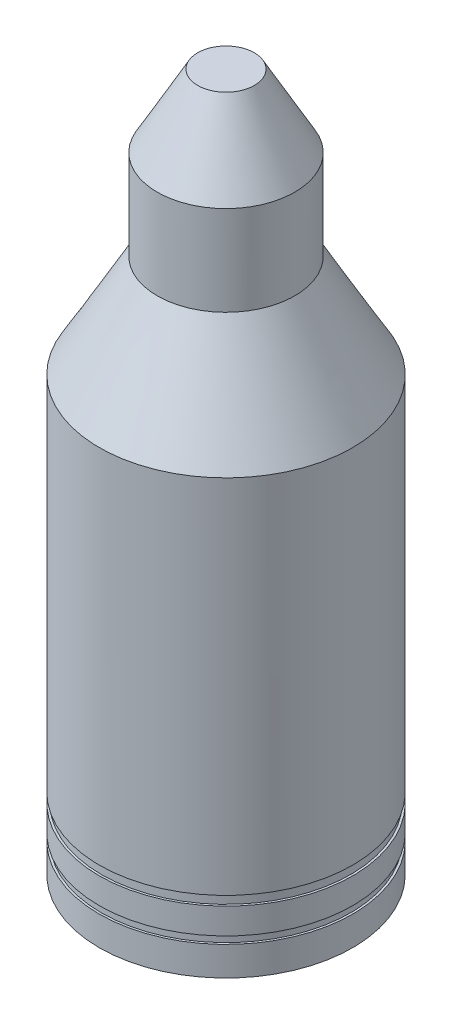
ISO-10303-21;
HEADER;
FILE_DESCRIPTION(('STEP AP214'),'2;1');
FILE_NAME('part.step','',(''),(''),'','','');
FILE_SCHEMA(('AUTOMOTIVE_DESIGN { 1 0 10303 214 1 1 1 1 }'));
ENDSEC;
DATA;
#1=APPLICATION_CONTEXT('core data for automotive mechanical design processes');
#2=APPLICATION_PROTOCOL_DEFINITION('international standard','automotive_design',2000,#1);
#3=PRODUCT_CONTEXT('',#1,'mechanical');
#4=PRODUCT('Part','Part','',(#3));
#5=PRODUCT_RELATED_PRODUCT_CATEGORY('part','',(#4));
#6=PRODUCT_DEFINITION_FORMATION('','',#4);
#7=PRODUCT_DEFINITION_CONTEXT('part definition',#1,'design');
#8=PRODUCT_DEFINITION('design','',#6,#7);
#9=PRODUCT_DEFINITION_SHAPE('','',#8);
#10=(LENGTH_UNIT() NAMED_UNIT(*) SI_UNIT(.MILLI.,.METRE.));
#11=(NAMED_UNIT(*) PLANE_ANGLE_UNIT() SI_UNIT($,.RADIAN.));
#12=(NAMED_UNIT(*) SI_UNIT($,.STERADIAN.) SOLID_ANGLE_UNIT());
#13=UNCERTAINTY_MEASURE_WITH_UNIT(LENGTH_MEASURE(1.E-05),#10,'distance_accuracy_value','');
#14=(GEOMETRIC_REPRESENTATION_CONTEXT(3) GLOBAL_UNCERTAINTY_ASSIGNED_CONTEXT((#13)) GLOBAL_UNIT_ASSIGNED_CONTEXT((#10,
#11,#12)) REPRESENTATION_CONTEXT('',''));
#15=CARTESIAN_POINT('',(0.,0.,0.));
#16=DIRECTION('',(0.,0.,1.));
#17=DIRECTION('',(1.,0.,0.));
#18=AXIS2_PLACEMENT_3D('',#15,#16,#17);
#19=CARTESIAN_POINT('',(0.,65.36,0.));
#20=DIRECTION('',(0.,-1.,0.));
#21=DIRECTION('',(0.,0.,-1.));
#22=AXIS2_PLACEMENT_3D('',#19,#20,#21);
#23=CYLINDRICAL_SURFACE('',#22,19.125);
#24=CARTESIAN_POINT('',(0.,10.8,0.));
#25=DIRECTION('',(0.,1.,0.));
#26=DIRECTION('',(0.,0.,1.));
#27=AXIS2_PLACEMENT_3D('',#24,#25,#26);
#28=CIRCLE('',#27,19.125);
#29=CARTESIAN_POINT('',(0.,10.8,19.125));
#30=VERTEX_POINT('',#29);
#31=EDGE_CURVE('E185',#30,#30,#28,.T.);
#32=ORIENTED_EDGE('',*,*,#31,.T.);
#33=EDGE_LOOP('',(#32));
#34=FACE_BOUND('',#33,.T.);
#35=CARTESIAN_POINT('',(0.,65.36,0.));
#36=DIRECTION('',(0.,-1.,0.));
#37=DIRECTION('',(0.,0.,-1.));
#38=AXIS2_PLACEMENT_3D('',#35,#36,#37);
#39=CIRCLE('',#38,19.125);
#40=CARTESIAN_POINT('',(-0.864899534711095,65.36,19.1054330962388));
#41=VERTEX_POINT('',#40);
#42=EDGE_CURVE('E12',#41,#41,#39,.F.);
#43=ORIENTED_EDGE('',*,*,#42,.F.);
#44=EDGE_LOOP('',(#43));
#45=FACE_BOUND('',#44,.T.);
#46=ADVANCED_FACE('F47',(#34,#45),#23,.T.);
#47=CARTESIAN_POINT('',(-0.864899534711095,65.36,19.1054330962388));
#48=CARTESIAN_POINT('',(-2.33951280515798,80.81,10.1077843682234));
#49=CARTESIAN_POINT('',(37.3459666577665,65.36,20.835232165661));
#50=CARTESIAN_POINT('',(17.8760559312889,80.81,14.7868099785394));
#51=CARTESIAN_POINT('',(39.0757657271887,65.36,-17.3756340268166));
#52=CARTESIAN_POINT('',(22.5550815416048,80.81,-5.42875875790748));
#53=CARTESIAN_POINT('',(0.864899534711076,65.36,-19.1054330962388));
#54=CARTESIAN_POINT('',(2.33951280515797,80.81,-10.1077843682234));
#55=CARTESIAN_POINT('',(-37.3459666577665,65.36,-20.8352321656609));
#56=CARTESIAN_POINT('',(-17.8760559312889,80.81,-14.7868099785394));
#57=CARTESIAN_POINT('',(-39.0757657271886,65.36,17.3756340268166));
#58=CARTESIAN_POINT('',(-22.5550815416048,80.81,5.42875875790748));
#59=CARTESIAN_POINT('',(-0.864899534711095,65.36,19.1054330962388));
#60=CARTESIAN_POINT('',(-2.33951280515798,80.81,10.1077843682234));
#61=(BOUNDED_SURFACE() B_SPLINE_SURFACE(3,1,((#47,#48),(#49,#50),(#51,#52),(#53,#54),(#55,#56),
(#57,#58),(#59,#60)),.UNSPECIFIED.,.T.,.F.,.F.) B_SPLINE_SURFACE_WITH_KNOTS((4,3,4),(2,2),(0.,
0.5,1.),(0.,1.),.UNSPECIFIED.) GEOMETRIC_REPRESENTATION_ITEM() RATIONAL_B_SPLINE_SURFACE(((1.,
1.),(0.333333333333333,0.333333333333333),(0.333333333333333,0.333333333333333),(1.,1.),
(0.333333333333333,0.333333333333333),(0.333333333333333,0.333333333333333),(1.,1.))) REPRESENTATION_ITEM('') SURFACE());
#62=CARTESIAN_POINT('',(0.,80.81,0.));
#63=DIRECTION('',(0.,1.,0.));
#64=DIRECTION('',(0.,0.,1.));
#65=AXIS2_PLACEMENT_3D('',#62,#63,#64);
#66=CIRCLE('',#65,10.375);
#67=CARTESIAN_POINT('',(-2.33951280515798,80.81,10.1077843682234));
#68=VERTEX_POINT('',#67);
#69=EDGE_CURVE('E61',#68,#68,#66,.T.);
#70=CARTESIAN_POINT('',(-0.864899534711095,65.36,19.1054330962388));
#71=CARTESIAN_POINT('',(-0.880260089611583,65.5209375,19.0117075886553));
#72=CARTESIAN_POINT('',(-0.895620644512072,65.681875,18.9179820810718));
#73=CARTESIAN_POINT('',(-0.926341754313049,66.00375,18.7305310659048));
#74=CARTESIAN_POINT('',(-0.941702309213537,66.1646875,18.6368055583213));
#75=CARTESIAN_POINT('',(-0.972423419014514,66.4865625,18.4493545431543));
#76=CARTESIAN_POINT('',(-0.987783973915002,66.6475,18.3556290355708));
#77=CARTESIAN_POINT('',(-1.01850508371598,66.969375,18.1681780204039));
#78=CARTESIAN_POINT('',(-1.03386563861647,67.1303125,18.0744525128204));
#79=CARTESIAN_POINT('',(-1.06458674841744,67.4521875,17.8870014976534));
#80=CARTESIAN_POINT('',(-1.07994730331793,67.613125,17.7932759900699));
#81=CARTESIAN_POINT('',(-1.11066841311891,67.935,17.6058249749029));
#82=CARTESIAN_POINT('',(-1.1260289680194,68.0959375,17.5120994673194));
#83=CARTESIAN_POINT('',(-1.15675007782037,68.4178125,17.3246484521524));
#84=CARTESIAN_POINT('',(-1.17211063272086,68.57875,17.2309229445689));
#85=CARTESIAN_POINT('',(-1.20283174252184,68.900625,17.0434719294019));
#86=CARTESIAN_POINT('',(-1.21819229742233,69.0615625,16.9497464218184));
#87=CARTESIAN_POINT('',(-1.24891340722331,69.3834375,16.7622954066515));
#88=CARTESIAN_POINT('',(-1.26427396212379,69.544375,16.668569899068));
#89=CARTESIAN_POINT('',(-1.29499507192477,69.86625,16.481118883901));
#90=CARTESIAN_POINT('',(-1.31035562682526,70.0271875,16.3873933763175));
#91=CARTESIAN_POINT('',(-1.34107673662624,70.3490625,16.1999423611505));
#92=CARTESIAN_POINT('',(-1.35643729152672,70.51,16.106216853567));
#93=CARTESIAN_POINT('',(-1.3871584013277,70.831875,15.9187658384));
#94=CARTESIAN_POINT('',(-1.40251895622819,70.9928125,15.8250403308165));
#95=CARTESIAN_POINT('',(-1.43324006602917,71.3146875,15.6375893156495));
#96=CARTESIAN_POINT('',(-1.44860062092965,71.475625,15.543863808066));
#97=CARTESIAN_POINT('',(-1.47932173073063,71.7975,15.3564127928991));
#98=CARTESIAN_POINT('',(-1.49468228563112,71.9584375,15.2626872853156));
#99=CARTESIAN_POINT('',(-1.5254033954321,72.2803125,15.0752362701486));
#100=CARTESIAN_POINT('',(-1.54076395033259,72.44125,14.9815107625651));
#101=CARTESIAN_POINT('',(-1.57148506013356,72.763125,14.7940597473981));
#102=CARTESIAN_POINT('',(-1.58684561503405,72.9240625,14.7003342398146));
#103=CARTESIAN_POINT('',(-1.61756672483503,73.2459375,14.5128832246476));
#104=CARTESIAN_POINT('',(-1.63292727973552,73.406875,14.4191577170641));
#105=CARTESIAN_POINT('',(-1.66364838953649,73.72875,14.2317067018971));
#106=CARTESIAN_POINT('',(-1.67900894443698,73.8896875,14.1379811943136));
#107=CARTESIAN_POINT('',(-1.70973005423796,74.2115625,13.9505301791467));
#108=CARTESIAN_POINT('',(-1.72509060913845,74.3725,13.8568046715632));
#109=CARTESIAN_POINT('',(-1.75581171893942,74.694375,13.6693536563962));
#110=CARTESIAN_POINT('',(-1.77117227383991,74.8553125,13.5756281488127));
#111=CARTESIAN_POINT('',(-1.80189338364089,75.1771875,13.3881771336457));
#112=CARTESIAN_POINT('',(-1.81725393854138,75.338125,13.2944516260622));
#113=CARTESIAN_POINT('',(-1.84797504834235,75.66,13.1070006108952));
#114=CARTESIAN_POINT('',(-1.86333560324284,75.8209375,13.0132751033117));
#115=CARTESIAN_POINT('',(-1.89405671304382,76.1428125,12.8258240881447));
#116=CARTESIAN_POINT('',(-1.90941726794431,76.30375,12.7320985805612));
#117=CARTESIAN_POINT('',(-1.94013837774528,76.625625,12.5446475653943));
#118=CARTESIAN_POINT('',(-1.95549893264577,76.7865625,12.4509220578108));
#119=CARTESIAN_POINT('',(-1.98622004244675,77.1084375,12.2634710426438));
#120=CARTESIAN_POINT('',(-2.00158059734724,77.269375,12.1697455350603));
#121=CARTESIAN_POINT('',(-2.03230170714822,77.59125,11.9822945198933));
#122=CARTESIAN_POINT('',(-2.0476622620487,77.7521875,11.8885690123098));
#123=CARTESIAN_POINT('',(-2.07838337184968,78.0740625,11.7011179971428));
#124=CARTESIAN_POINT('',(-2.09374392675017,78.235,11.6073924895593));
#125=CARTESIAN_POINT('',(-2.12446503655114,78.556875,11.4199414743923));
#126=CARTESIAN_POINT('',(-2.13982559145163,78.7178125,11.3262159668088));
#127=CARTESIAN_POINT('',(-2.17054670125261,79.0396875,11.1387649516419));
#128=CARTESIAN_POINT('',(-2.1859072561531,79.200625,11.0450394440584));
#129=CARTESIAN_POINT('',(-2.21662836595408,79.5225,10.8575884288914));
#130=CARTESIAN_POINT('',(-2.23198892085456,79.6834375,10.7638629213079));
#131=CARTESIAN_POINT('',(-2.26271003065554,80.0053125,10.5764119061409));
#132=CARTESIAN_POINT('',(-2.27807058555603,80.16625,10.4826863985574));
#133=CARTESIAN_POINT('',(-2.30879169535701,80.488125,10.2952353833904));
#134=CARTESIAN_POINT('',(-2.32415225025749,80.6490625,10.2015098758069));
#135=CARTESIAN_POINT('',(-2.33951280515798,80.81,10.1077843682234));
#136=B_SPLINE_CURVE_WITH_KNOTS('',3,(#70,#71,#72,#73,#74,#75,#76,#77,#78,#79,#80,#81,#82,#83,
#84,#85,#86,#87,#88,#89,#90,#91,#92,#93,#94,#95,#96,#97,#98,#99,#100,#101,#102,#103,#104,#105,
#106,#107,#108,#109,#110,#111,#112,#113,#114,#115,#116,#117,#118,#119,#120,#121,#122,#123,#124,
#125,#126,#127,#128,#129,#130,#131,#132,#133,#134,#135),.UNSPECIFIED.,.F.,.F.,(4,2,2,2,2,2,2,2,
2,2,2,2,2,2,2,2,2,2,2,2,2,2,2,2,2,2,2,2,2,2,2,2,4),(0.,0.560617219610634,1.12123443922127,
1.6818516588319,2.24246887844254,2.80308609805317,3.36370331766381,3.92432053727445,
4.48493775688508,5.04555497649572,5.60617219610636,6.16678941571699,6.72740663532761,
7.28802385493826,7.84864107454888,8.40925829415953,8.96987551377016,9.5304927333808,
10.0911099529914,10.6517271726021,11.2123443922127,11.7729616118233,12.333578831434,
12.8941960510446,13.4548132706553,14.0154304902659,14.5760477098765,15.1366649294872,
15.6972821490978,16.2578993687084,16.8185165883191,17.3791338079297,17.9397510275403),.UNSPECIFIED.);
#137=EDGE_CURVE('BSEAM87',#41,#68,#136,.T.);
#138=ORIENTED_EDGE('',*,*,#42,.T.);
#139=ORIENTED_EDGE('',*,*,#69,.F.);
#140=ORIENTED_EDGE('',*,*,#137,.T.);
#141=ORIENTED_EDGE('',*,*,#137,.F.);
#142=EDGE_LOOP('',(#138,#140,#139,#141));
#143=FACE_BOUND('',#142,.T.);
#144=ADVANCED_FACE('F87',(#143),#61,.T.);
#145=CARTESIAN_POINT('',(0.,94.36,0.));
#146=DIRECTION('',(0.,-1.,0.));
#147=DIRECTION('',(0.,0.,-1.));
#148=AXIS2_PLACEMENT_3D('',#145,#146,#147);
#149=CYLINDRICAL_SURFACE('',#148,10.375);
#150=CARTESIAN_POINT('',(0.,94.36,0.));
#151=DIRECTION('',(0.,-1.,0.));
#152=DIRECTION('',(0.,0.,-1.));
#153=AXIS2_PLACEMENT_3D('',#150,#151,#152);
#154=CIRCLE('',#153,10.375);
#155=CARTESIAN_POINT('',(0.,94.36,-10.375));
#156=VERTEX_POINT('',#155);
#157=EDGE_CURVE('E120',#156,#156,#154,.F.);
#158=ORIENTED_EDGE('',*,*,#157,.F.);
#159=EDGE_LOOP('',(#158));
#160=FACE_BOUND('',#159,.T.);
#161=ORIENTED_EDGE('',*,*,#69,.T.);
#162=EDGE_LOOP('',(#161));
#163=FACE_BOUND('',#162,.T.);
#164=ADVANCED_FACE('F76',(#160,#163),#149,.T.);
#165=CARTESIAN_POINT('',(0.,105.26,0.));
#166=DIRECTION('',(0.,1.,0.));
#167=DIRECTION('',(0.,0.,1.));
#168=AXIS2_PLACEMENT_3D('',#165,#166,#167);
#169=PLANE('',#168);
#170=CARTESIAN_POINT('',(0.,105.26,0.));
#171=DIRECTION('',(0.,1.,0.));
#172=DIRECTION('',(0.,0.,1.));
#173=AXIS2_PLACEMENT_3D('',#170,#171,#172);
#174=CIRCLE('',#173,4.275);
#175=CARTESIAN_POINT('',(0.,105.26,4.275));
#176=VERTEX_POINT('',#175);
#177=EDGE_CURVE('E116',#176,#176,#174,.T.);
#178=ORIENTED_EDGE('',*,*,#177,.T.);
#179=EDGE_LOOP('',(#178));
#180=FACE_BOUND('',#179,.T.);
#181=ADVANCED_FACE('F86',(#180),#169,.T.);
#182=CARTESIAN_POINT('',(0.,105.26,0.));
#183=DIRECTION('',(0.,-1.,0.));
#184=DIRECTION('',(0.,0.,-1.));
#185=AXIS2_PLACEMENT_3D('',#182,#183,#184);
#186=CONICAL_SURFACE('',#185,4.275,0.510208914268277);
#187=ORIENTED_EDGE('',*,*,#177,.F.);
#188=EDGE_LOOP('',(#187));
#189=FACE_BOUND('',#188,.T.);
#190=ORIENTED_EDGE('',*,*,#157,.T.);
#191=EDGE_LOOP('',(#190));
#192=FACE_BOUND('',#191,.T.);
#193=ADVANCED_FACE('F89',(#189,#192),#186,.T.);
#194=CARTESIAN_POINT('',(0.,9.4,0.));
#195=DIRECTION('',(0.,1.,0.));
#196=DIRECTION('',(0.,0.,1.));
#197=AXIS2_PLACEMENT_3D('',#194,#195,#196);
#198=PLANE('',#197);
#199=CARTESIAN_POINT('',(0.,9.4,0.));
#200=DIRECTION('',(0.,1.,0.));
#201=DIRECTION('',(0.,0.,1.));
#202=AXIS2_PLACEMENT_3D('',#199,#200,#201);
#203=CIRCLE('',#202,18.8);
#204=CARTESIAN_POINT('',(0.,9.4,18.8));
#205=VERTEX_POINT('',#204);
#206=EDGE_CURVE('E188',#205,#205,#203,.T.);
#207=ORIENTED_EDGE('',*,*,#206,.F.);
#208=EDGE_LOOP('',(#207));
#209=FACE_BOUND('',#208,.T.);
#210=CARTESIAN_POINT('',(0.,9.4,0.));
#211=DIRECTION('',(0.,1.,0.));
#212=DIRECTION('',(0.,0.,1.));
#213=AXIS2_PLACEMENT_3D('',#210,#211,#212);
#214=CIRCLE('',#213,19.125);
#215=CARTESIAN_POINT('',(0.,9.4,19.125));
#216=VERTEX_POINT('',#215);
#217=EDGE_CURVE('E121',#216,#216,#214,.T.);
#218=ORIENTED_EDGE('',*,*,#217,.T.);
#219=EDGE_LOOP('',(#218));
#220=FACE_BOUND('',#219,.T.);
#221=ADVANCED_FACE('F139',(#209,#220),#198,.T.);
#222=CARTESIAN_POINT('',(0.,10.8,0.));
#223=DIRECTION('',(0.,1.,0.));
#224=DIRECTION('',(0.,0.,1.));
#225=AXIS2_PLACEMENT_3D('',#222,#223,#224);
#226=PLANE('',#225);
#227=CARTESIAN_POINT('',(0.,10.8,0.));
#228=DIRECTION('',(0.,1.,0.));
#229=DIRECTION('',(0.,0.,1.));
#230=AXIS2_PLACEMENT_3D('',#227,#228,#229);
#231=CIRCLE('',#230,18.8);
#232=CARTESIAN_POINT('',(0.,10.8,18.8));
#233=VERTEX_POINT('',#232);
#234=EDGE_CURVE('E191',#233,#233,#231,.T.);
#235=ORIENTED_EDGE('',*,*,#234,.T.);
#236=EDGE_LOOP('',(#235));
#237=FACE_BOUND('',#236,.T.);
#238=ORIENTED_EDGE('',*,*,#31,.F.);
#239=EDGE_LOOP('',(#238));
#240=FACE_BOUND('',#239,.T.);
#241=ADVANCED_FACE('F135',(#237,#240),#226,.F.);
#242=CARTESIAN_POINT('',(0.,9.4,0.));
#243=DIRECTION('',(0.,1.,0.));
#244=DIRECTION('',(0.,0.,1.));
#245=AXIS2_PLACEMENT_3D('',#242,#243,#244);
#246=CYLINDRICAL_SURFACE('',#245,18.8);
#247=ORIENTED_EDGE('',*,*,#206,.T.);
#248=EDGE_LOOP('',(#247));
#249=FACE_BOUND('',#248,.T.);
#250=ORIENTED_EDGE('',*,*,#234,.F.);
#251=EDGE_LOOP('',(#250));
#252=FACE_BOUND('',#251,.T.);
#253=ADVANCED_FACE('F138',(#249,#252),#246,.T.);
#254=CARTESIAN_POINT('',(0.,5.50000000000001,0.));
#255=DIRECTION('',(0.,1.,0.));
#256=DIRECTION('',(0.,0.,1.));
#257=AXIS2_PLACEMENT_3D('',#254,#255,#256);
#258=CIRCLE('',#257,19.125);
#259=CARTESIAN_POINT('',(0.,5.50000000000001,19.125));
#260=VERTEX_POINT('',#259);
#261=EDGE_CURVE('E50',#260,#260,#258,.T.);
#262=ORIENTED_EDGE('',*,*,#261,.T.);
#263=EDGE_LOOP('',(#262));
#264=FACE_BOUND('',#263,.T.);
#265=ORIENTED_EDGE('',*,*,#217,.F.);
#266=EDGE_LOOP('',(#265));
#267=FACE_BOUND('',#266,.T.);
#268=ADVANCED_FACE('F146',(#264,#267),#23,.T.);
#269=CARTESIAN_POINT('',(0.,5.5,0.));
#270=DIRECTION('',(0.,1.,0.));
#271=DIRECTION('',(0.,0.,1.));
#272=AXIS2_PLACEMENT_3D('',#269,#270,#271);
#273=PLANE('',#272);
#274=CARTESIAN_POINT('',(0.,5.5,0.));
#275=DIRECTION('',(0.,1.,0.));
#276=DIRECTION('',(0.,0.,1.));
#277=AXIS2_PLACEMENT_3D('',#274,#275,#276);
#278=CIRCLE('',#277,18.8);
#279=CARTESIAN_POINT('',(0.,5.5,18.8));
#280=VERTEX_POINT('',#279);
#281=EDGE_CURVE('E214',#280,#280,#278,.T.);
#282=ORIENTED_EDGE('',*,*,#281,.T.);
#283=EDGE_LOOP('',(#282));
#284=FACE_BOUND('',#283,.T.);
#285=ORIENTED_EDGE('',*,*,#261,.F.);
#286=EDGE_LOOP('',(#285));
#287=FACE_BOUND('',#286,.T.);
#288=ADVANCED_FACE('F152',(#284,#287),#273,.F.);
#289=CARTESIAN_POINT('',(0.,4.4,0.));
#290=DIRECTION('',(0.,1.,0.));
#291=DIRECTION('',(0.,0.,1.));
#292=AXIS2_PLACEMENT_3D('',#289,#290,#291);
#293=PLANE('',#292);
#294=CARTESIAN_POINT('',(0.,4.4,0.));
#295=DIRECTION('',(0.,1.,0.));
#296=DIRECTION('',(0.,0.,1.));
#297=AXIS2_PLACEMENT_3D('',#294,#295,#296);
#298=CIRCLE('',#297,18.8);
#299=CARTESIAN_POINT('',(0.,4.4,18.8));
#300=VERTEX_POINT('',#299);
#301=EDGE_CURVE('E220',#300,#300,#298,.T.);
#302=ORIENTED_EDGE('',*,*,#301,.F.);
#303=EDGE_LOOP('',(#302));
#304=FACE_BOUND('',#303,.T.);
#305=CARTESIAN_POINT('',(0.,4.4,0.));
#306=DIRECTION('',(0.,1.,0.));
#307=DIRECTION('',(0.,0.,1.));
#308=AXIS2_PLACEMENT_3D('',#305,#306,#307);
#309=CIRCLE('',#308,19.125);
#310=CARTESIAN_POINT('',(0.,4.4,19.125));
#311=VERTEX_POINT('',#310);
#312=EDGE_CURVE('E211',#311,#311,#309,.T.);
#313=ORIENTED_EDGE('',*,*,#312,.T.);
#314=EDGE_LOOP('',(#313));
#315=FACE_BOUND('',#314,.T.);
#316=ADVANCED_FACE('F148',(#304,#315),#293,.T.);
#317=CARTESIAN_POINT('',(0.,5.5,0.));
#318=DIRECTION('',(0.,-1.,0.));
#319=DIRECTION('',(0.,0.,-1.));
#320=AXIS2_PLACEMENT_3D('',#317,#318,#319);
#321=CYLINDRICAL_SURFACE('',#320,18.8);
#322=ORIENTED_EDGE('',*,*,#281,.F.);
#323=EDGE_LOOP('',(#322));
#324=FACE_BOUND('',#323,.T.);
#325=ORIENTED_EDGE('',*,*,#301,.T.);
#326=EDGE_LOOP('',(#325));
#327=FACE_BOUND('',#326,.T.);
#328=ADVANCED_FACE('F151',(#324,#327),#321,.T.);
#329=CARTESIAN_POINT('',(0.,0.,0.));
#330=DIRECTION('',(0.,1.,0.));
#331=DIRECTION('',(0.,0.,1.));
#332=AXIS2_PLACEMENT_3D('',#329,#330,#331);
#333=PLANE('',#332);
#334=CARTESIAN_POINT('',(0.,0.,0.));
#335=DIRECTION('',(0.,1.,0.));
#336=DIRECTION('',(0.,0.,1.));
#337=AXIS2_PLACEMENT_3D('',#334,#335,#336);
#338=CIRCLE('',#337,19.125);
#339=CARTESIAN_POINT('',(0.,0.,19.125));
#340=VERTEX_POINT('',#339);
#341=EDGE_CURVE('E55',#340,#340,#338,.T.);
#342=ORIENTED_EDGE('',*,*,#341,.F.);
#343=EDGE_LOOP('',(#342));
#344=FACE_BOUND('',#343,.T.);
#345=ADVANCED_FACE('F96',(#344),#333,.F.);
#346=ORIENTED_EDGE('',*,*,#341,.T.);
#347=EDGE_LOOP('',(#346));
#348=FACE_BOUND('',#347,.T.);
#349=ORIENTED_EDGE('',*,*,#312,.F.);
#350=EDGE_LOOP('',(#349));
#351=FACE_BOUND('',#350,.T.);
#352=ADVANCED_FACE('F162',(#348,#351),#23,.T.);
#353=CLOSED_SHELL('',(#46,#144,#164,#181,#193,#221,#241,#253,#268,#288,#316,#328,#345,#352));
#354=MANIFOLD_SOLID_BREP('B2',#353);
#355=ADVANCED_BREP_SHAPE_REPRESENTATION('',(#18,#354),#14);
#356=SHAPE_DEFINITION_REPRESENTATION(#9,#355);
ENDSEC;
END-ISO-10303-21;
